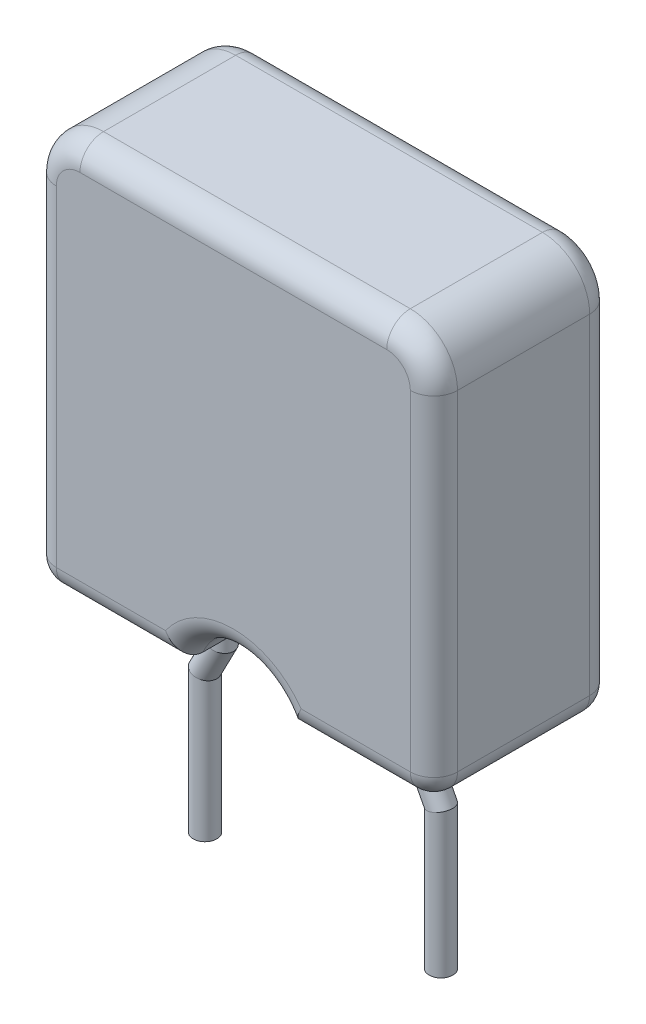
ISO-10303-21;
HEADER;
FILE_DESCRIPTION(('STEP AP214'),'2;1');
FILE_NAME('part.step','',(''),(''),'','','');
FILE_SCHEMA(('AUTOMOTIVE_DESIGN { 1 0 10303 214 1 1 1 1 }'));
ENDSEC;
DATA;
#1=APPLICATION_CONTEXT('core data for automotive mechanical design processes');
#2=APPLICATION_PROTOCOL_DEFINITION('international standard','automotive_design',2000,#1);
#3=PRODUCT_CONTEXT('',#1,'mechanical');
#4=PRODUCT('Part','Part','',(#3));
#5=PRODUCT_RELATED_PRODUCT_CATEGORY('part','',(#4));
#6=PRODUCT_DEFINITION_FORMATION('','',#4);
#7=PRODUCT_DEFINITION_CONTEXT('part definition',#1,'design');
#8=PRODUCT_DEFINITION('design','',#6,#7);
#9=PRODUCT_DEFINITION_SHAPE('','',#8);
#10=(LENGTH_UNIT() NAMED_UNIT(*) SI_UNIT(.MILLI.,.METRE.));
#11=(NAMED_UNIT(*) PLANE_ANGLE_UNIT() SI_UNIT($,.RADIAN.));
#12=(NAMED_UNIT(*) SI_UNIT($,.STERADIAN.) SOLID_ANGLE_UNIT());
#13=UNCERTAINTY_MEASURE_WITH_UNIT(LENGTH_MEASURE(1.E-05),#10,'distance_accuracy_value','');
#14=(GEOMETRIC_REPRESENTATION_CONTEXT(3) GLOBAL_UNCERTAINTY_ASSIGNED_CONTEXT((#13)) GLOBAL_UNIT_ASSIGNED_CONTEXT((#10,
#11,#12)) REPRESENTATION_CONTEXT('',''));
#15=CARTESIAN_POINT('',(0.,0.,0.));
#16=DIRECTION('',(0.,0.,1.));
#17=DIRECTION('',(1.,0.,0.));
#18=AXIS2_PLACEMENT_3D('',#15,#16,#17);
#19=CARTESIAN_POINT('',(-4.25,-4.25,3.8));
#20=DIRECTION('',(0.,1.,0.));
#21=DIRECTION('',(0.,0.,1.));
#22=AXIS2_PLACEMENT_3D('',#19,#20,#21);
#23=PLANE('',#22);
#24=CARTESIAN_POINT('',(-2.14564392373896,-4.25,1.9));
#25=DIRECTION('',(0.,1.,0.));
#26=DIRECTION('',(0.,0.,1.));
#27=AXIS2_PLACEMENT_3D('',#24,#25,#26);
#28=CIRCLE('',#27,0.25);
#29=CARTESIAN_POINT('',(-2.14564392373896,-4.25,2.15));
#30=VERTEX_POINT('',#29);
#31=EDGE_CURVE('E76',#30,#30,#28,.F.);
#32=ORIENTED_EDGE('',*,*,#31,.F.);
#33=EDGE_LOOP('',(#32));
#34=FACE_BOUND('',#33,.T.);
#35=DIRECTION('',(0.,0.,-1.));
#36=VECTOR('',#35,1.);
#37=CARTESIAN_POINT('',(-3.75,-4.25,3.8));
#38=LINE('',#37,#36);
#39=CARTESIAN_POINT('',(-3.75,-4.25,3.3));
#40=VERTEX_POINT('',#39);
#41=CARTESIAN_POINT('',(-3.75,-4.25,0.5));
#42=VERTEX_POINT('',#41);
#43=EDGE_CURVE('E491',#40,#42,#38,.T.);
#44=ORIENTED_EDGE('',*,*,#43,.T.);
#45=DIRECTION('',(1.,0.,0.));
#46=VECTOR('',#45,1.);
#47=CARTESIAN_POINT('',(-1.14564392373896,-4.25,0.5));
#48=LINE('',#47,#46);
#49=CARTESIAN_POINT('',(-1.14564392373896,-4.25,0.5));
#50=VERTEX_POINT('',#49);
#51=EDGE_CURVE('E262',#42,#50,#48,.T.);
#52=ORIENTED_EDGE('',*,*,#51,.T.);
#53=DIRECTION('',(0.,0.,1.));
#54=VECTOR('',#53,1.);
#55=CARTESIAN_POINT('',(-1.14564392373896,-4.25,0.));
#56=LINE('',#55,#54);
#57=CARTESIAN_POINT('',(-1.14564392373896,-4.25,3.3));
#58=VERTEX_POINT('',#57);
#59=EDGE_CURVE('E466',#50,#58,#56,.T.);
#60=ORIENTED_EDGE('',*,*,#59,.T.);
#61=DIRECTION('',(1.,0.,0.));
#62=VECTOR('',#61,1.);
#63=CARTESIAN_POINT('',(-4.25,-4.25,3.3));
#64=LINE('',#63,#62);
#65=EDGE_CURVE('E259',#58,#40,#64,.F.);
#66=ORIENTED_EDGE('',*,*,#65,.T.);
#67=EDGE_LOOP('',(#44,#52,#60,#66));
#68=FACE_BOUND('',#67,.T.);
#69=ADVANCED_FACE('F67',(#34,#68),#23,.F.);
#70=CARTESIAN_POINT('',(4.25,-4.25,3.8));
#71=DIRECTION('',(-1.,0.,0.));
#72=DIRECTION('',(0.,0.,1.));
#73=AXIS2_PLACEMENT_3D('',#70,#71,#72);
#74=PLANE('',#73);
#75=DIRECTION('',(0.,0.,-1.));
#76=VECTOR('',#75,1.);
#77=CARTESIAN_POINT('',(4.25,-3.75,3.8));
#78=LINE('',#77,#76);
#79=CARTESIAN_POINT('',(4.25,-3.75,3.3));
#80=VERTEX_POINT('',#79);
#81=CARTESIAN_POINT('',(4.25,-3.75,0.5));
#82=VERTEX_POINT('',#81);
#83=EDGE_CURVE('E480',#80,#82,#78,.T.);
#84=ORIENTED_EDGE('',*,*,#83,.T.);
#85=DIRECTION('',(0.,1.,0.));
#86=VECTOR('',#85,1.);
#87=CARTESIAN_POINT('',(4.25,3.25,0.5));
#88=LINE('',#87,#86);
#89=CARTESIAN_POINT('',(4.25,3.25,0.5));
#90=VERTEX_POINT('',#89);
#91=EDGE_CURVE('E287',#82,#90,#88,.T.);
#92=ORIENTED_EDGE('',*,*,#91,.T.);
#93=DIRECTION('',(0.,0.,-1.));
#94=VECTOR('',#93,1.);
#95=CARTESIAN_POINT('',(4.25,3.25,3.8));
#96=LINE('',#95,#94);
#97=CARTESIAN_POINT('',(4.25,3.25,3.3));
#98=VERTEX_POINT('',#97);
#99=EDGE_CURVE('E495',#90,#98,#96,.F.);
#100=ORIENTED_EDGE('',*,*,#99,.T.);
#101=DIRECTION('',(0.,1.,0.));
#102=VECTOR('',#101,1.);
#103=CARTESIAN_POINT('',(4.25,-4.25,3.3));
#104=LINE('',#103,#102);
#105=EDGE_CURVE('E284',#98,#80,#104,.F.);
#106=ORIENTED_EDGE('',*,*,#105,.T.);
#107=EDGE_LOOP('',(#84,#92,#100,#106));
#108=FACE_BOUND('',#107,.T.);
#109=ADVANCED_FACE('F429',(#108),#74,.F.);
#110=CARTESIAN_POINT('',(-4.25,4.25,3.8));
#111=DIRECTION('',(0.,-1.,0.));
#112=DIRECTION('',(0.,0.,-1.));
#113=AXIS2_PLACEMENT_3D('',#110,#111,#112);
#114=PLANE('',#113);
#115=DIRECTION('',(0.,0.,-1.));
#116=VECTOR('',#115,1.);
#117=CARTESIAN_POINT('',(3.25,4.25,3.8));
#118=LINE('',#117,#116);
#119=CARTESIAN_POINT('',(3.25,4.25,3.3));
#120=VERTEX_POINT('',#119);
#121=CARTESIAN_POINT('',(3.25,4.25,0.5));
#122=VERTEX_POINT('',#121);
#123=EDGE_CURVE('E532',#120,#122,#118,.T.);
#124=ORIENTED_EDGE('',*,*,#123,.T.);
#125=DIRECTION('',(-1.,0.,0.));
#126=VECTOR('',#125,1.);
#127=CARTESIAN_POINT('',(-3.25,4.25,0.5));
#128=LINE('',#127,#126);
#129=CARTESIAN_POINT('',(-3.25,4.25,0.5));
#130=VERTEX_POINT('',#129);
#131=EDGE_CURVE('E239',#122,#130,#128,.T.);
#132=ORIENTED_EDGE('',*,*,#131,.T.);
#133=DIRECTION('',(0.,0.,-1.));
#134=VECTOR('',#133,1.);
#135=CARTESIAN_POINT('',(-3.25,4.25,3.8));
#136=LINE('',#135,#134);
#137=CARTESIAN_POINT('',(-3.25,4.25,3.3));
#138=VERTEX_POINT('',#137);
#139=EDGE_CURVE('E536',#130,#138,#136,.F.);
#140=ORIENTED_EDGE('',*,*,#139,.T.);
#141=DIRECTION('',(-1.,0.,0.));
#142=VECTOR('',#141,1.);
#143=CARTESIAN_POINT('',(-4.25,4.25,3.3));
#144=LINE('',#143,#142);
#145=EDGE_CURVE('E236',#138,#120,#144,.F.);
#146=ORIENTED_EDGE('',*,*,#145,.T.);
#147=EDGE_LOOP('',(#124,#132,#140,#146));
#148=FACE_BOUND('',#147,.T.);
#149=ADVANCED_FACE('F436',(#148),#114,.F.);
#150=CARTESIAN_POINT('',(-4.25,-4.25,3.8));
#151=DIRECTION('',(1.,0.,0.));
#152=DIRECTION('',(0.,0.,-1.));
#153=AXIS2_PLACEMENT_3D('',#150,#151,#152);
#154=PLANE('',#153);
#155=DIRECTION('',(0.,0.,-1.));
#156=VECTOR('',#155,1.);
#157=CARTESIAN_POINT('',(-4.25,3.25,3.8));
#158=LINE('',#157,#156);
#159=CARTESIAN_POINT('',(-4.25,3.25,3.3));
#160=VERTEX_POINT('',#159);
#161=CARTESIAN_POINT('',(-4.25,3.25,0.5));
#162=VERTEX_POINT('',#161);
#163=EDGE_CURVE('E487',#160,#162,#158,.T.);
#164=ORIENTED_EDGE('',*,*,#163,.T.);
#165=DIRECTION('',(0.,-1.,0.));
#166=VECTOR('',#165,1.);
#167=CARTESIAN_POINT('',(-4.25,-3.75,0.5));
#168=LINE('',#167,#166);
#169=CARTESIAN_POINT('',(-4.25,-3.75,0.5));
#170=VERTEX_POINT('',#169);
#171=EDGE_CURVE('E250',#162,#170,#168,.T.);
#172=ORIENTED_EDGE('',*,*,#171,.T.);
#173=DIRECTION('',(0.,0.,-1.));
#174=VECTOR('',#173,1.);
#175=CARTESIAN_POINT('',(-4.25,-3.75,3.8));
#176=LINE('',#175,#174);
#177=CARTESIAN_POINT('',(-4.25,-3.75,3.3));
#178=VERTEX_POINT('',#177);
#179=EDGE_CURVE('E216',#170,#178,#176,.F.);
#180=ORIENTED_EDGE('',*,*,#179,.T.);
#181=DIRECTION('',(0.,-1.,0.));
#182=VECTOR('',#181,1.);
#183=CARTESIAN_POINT('',(-4.25,-4.25,3.3));
#184=LINE('',#183,#182);
#185=EDGE_CURVE('E247',#178,#160,#184,.F.);
#186=ORIENTED_EDGE('',*,*,#185,.T.);
#187=EDGE_LOOP('',(#164,#172,#180,#186));
#188=FACE_BOUND('',#187,.T.);
#189=ADVANCED_FACE('F445',(#188),#154,.F.);
#190=CARTESIAN_POINT('',(2.14564392373896,-4.25,1.9));
#191=DIRECTION('',(0.,1.,0.));
#192=DIRECTION('',(0.,0.,1.));
#193=AXIS2_PLACEMENT_3D('',#190,#191,#192);
#194=CIRCLE('',#193,0.25);
#195=CARTESIAN_POINT('',(2.14564392373896,-4.25,2.15));
#196=VERTEX_POINT('',#195);
#197=EDGE_CURVE('E12',#196,#196,#194,.F.);
#198=ORIENTED_EDGE('',*,*,#197,.F.);
#199=EDGE_LOOP('',(#198));
#200=FACE_BOUND('',#199,.T.);
#201=DIRECTION('',(0.,0.,1.));
#202=VECTOR('',#201,1.);
#203=CARTESIAN_POINT('',(1.14564392373896,-4.25,0.));
#204=LINE('',#203,#202);
#205=CARTESIAN_POINT('',(1.14564392373896,-4.25,3.3));
#206=VERTEX_POINT('',#205);
#207=CARTESIAN_POINT('',(1.14564392373896,-4.25,0.5));
#208=VERTEX_POINT('',#207);
#209=EDGE_CURVE('E457',#206,#208,#204,.F.);
#210=ORIENTED_EDGE('',*,*,#209,.T.);
#211=DIRECTION('',(1.,0.,0.));
#212=VECTOR('',#211,1.);
#213=CARTESIAN_POINT('',(3.75,-4.25,0.5));
#214=LINE('',#213,#212);
#215=CARTESIAN_POINT('',(3.75,-4.25,0.5));
#216=VERTEX_POINT('',#215);
#217=EDGE_CURVE('E275',#208,#216,#214,.T.);
#218=ORIENTED_EDGE('',*,*,#217,.T.);
#219=DIRECTION('',(0.,0.,-1.));
#220=VECTOR('',#219,1.);
#221=CARTESIAN_POINT('',(3.75,-4.25,3.8));
#222=LINE('',#221,#220);
#223=CARTESIAN_POINT('',(3.75,-4.25,3.3));
#224=VERTEX_POINT('',#223);
#225=EDGE_CURVE('E482',#216,#224,#222,.F.);
#226=ORIENTED_EDGE('',*,*,#225,.T.);
#227=DIRECTION('',(1.,0.,0.));
#228=VECTOR('',#227,1.);
#229=CARTESIAN_POINT('',(-4.25,-4.25,3.3));
#230=LINE('',#229,#228);
#231=EDGE_CURVE('E272',#224,#206,#230,.F.);
#232=ORIENTED_EDGE('',*,*,#231,.T.);
#233=EDGE_LOOP('',(#210,#218,#226,#232));
#234=FACE_BOUND('',#233,.T.);
#235=ADVANCED_FACE('F432',(#200,#234),#23,.F.);
#236=CARTESIAN_POINT('',(0.,0.,3.8));
#237=DIRECTION('',(0.,0.,-1.));
#238=DIRECTION('',(-1.,0.,0.));
#239=AXIS2_PLACEMENT_3D('',#236,#237,#238);
#240=PLANE('',#239);
#241=DIRECTION('',(1.,0.,0.));
#242=VECTOR('',#241,1.);
#243=CARTESIAN_POINT('',(0.,-3.75,3.8));
#244=LINE('',#243,#242);
#245=CARTESIAN_POINT('',(-3.75,-3.75,3.8));
#246=VERTEX_POINT('',#245);
#247=CARTESIAN_POINT('',(-1.43614066163451,-3.75,3.8));
#248=VERTEX_POINT('',#247);
#249=EDGE_CURVE('E83',#246,#248,#244,.T.);
#250=ORIENTED_EDGE('',*,*,#249,.T.);
#251=CARTESIAN_POINT('',(0.,-4.75,3.8));
#252=DIRECTION('',(0.,0.,-1.));
#253=DIRECTION('',(-1.,0.,0.));
#254=AXIS2_PLACEMENT_3D('',#251,#252,#253);
#255=CIRCLE('',#254,1.75);
#256=CARTESIAN_POINT('',(1.43614066163451,-3.75,3.8));
#257=VERTEX_POINT('',#256);
#258=EDGE_CURVE('E308',#248,#257,#255,.T.);
#259=ORIENTED_EDGE('',*,*,#258,.T.);
#260=DIRECTION('',(1.,0.,0.));
#261=VECTOR('',#260,1.);
#262=CARTESIAN_POINT('',(0.,-3.75,3.8));
#263=LINE('',#262,#261);
#264=CARTESIAN_POINT('',(3.75,-3.75,3.8));
#265=VERTEX_POINT('',#264);
#266=EDGE_CURVE('E290',#257,#265,#263,.T.);
#267=ORIENTED_EDGE('',*,*,#266,.T.);
#268=DIRECTION('',(0.,1.,0.));
#269=VECTOR('',#268,1.);
#270=CARTESIAN_POINT('',(3.75,0.,3.8));
#271=LINE('',#270,#269);
#272=CARTESIAN_POINT('',(3.75,3.25,3.8));
#273=VERTEX_POINT('',#272);
#274=EDGE_CURVE('E293',#265,#273,#271,.T.);
#275=ORIENTED_EDGE('',*,*,#274,.T.);
#276=CARTESIAN_POINT('',(3.25,3.25,3.8));
#277=DIRECTION('',(0.,0.,-1.));
#278=DIRECTION('',(-1.,0.,0.));
#279=AXIS2_PLACEMENT_3D('',#276,#277,#278);
#280=CIRCLE('',#279,0.5);
#281=CARTESIAN_POINT('',(3.25,3.75,3.8));
#282=VERTEX_POINT('',#281);
#283=EDGE_CURVE('E296',#273,#282,#280,.F.);
#284=ORIENTED_EDGE('',*,*,#283,.T.);
#285=DIRECTION('',(-1.,0.,0.));
#286=VECTOR('',#285,1.);
#287=CARTESIAN_POINT('',(0.,3.75,3.8));
#288=LINE('',#287,#286);
#289=CARTESIAN_POINT('',(-3.25,3.75,3.8));
#290=VERTEX_POINT('',#289);
#291=EDGE_CURVE('E299',#282,#290,#288,.T.);
#292=ORIENTED_EDGE('',*,*,#291,.T.);
#293=CARTESIAN_POINT('',(-3.25,3.25,3.8));
#294=DIRECTION('',(0.,0.,-1.));
#295=DIRECTION('',(-1.,0.,0.));
#296=AXIS2_PLACEMENT_3D('',#293,#294,#295);
#297=CIRCLE('',#296,0.5);
#298=CARTESIAN_POINT('',(-3.75,3.25,3.8));
#299=VERTEX_POINT('',#298);
#300=EDGE_CURVE('E302',#290,#299,#297,.F.);
#301=ORIENTED_EDGE('',*,*,#300,.T.);
#302=DIRECTION('',(0.,-1.,0.));
#303=VECTOR('',#302,1.);
#304=CARTESIAN_POINT('',(-3.75,0.,3.8));
#305=LINE('',#304,#303);
#306=EDGE_CURVE('E88',#299,#246,#305,.T.);
#307=ORIENTED_EDGE('',*,*,#306,.T.);
#308=EDGE_LOOP('',(#250,#259,#267,#275,#284,#292,#301,#307));
#309=FACE_BOUND('',#308,.T.);
#310=ADVANCED_FACE('F444',(#309),#240,.F.);
#311=CARTESIAN_POINT('',(0.,0.,0.));
#312=DIRECTION('',(0.,0.,-1.));
#313=DIRECTION('',(-1.,0.,0.));
#314=AXIS2_PLACEMENT_3D('',#311,#312,#313);
#315=PLANE('',#314);
#316=DIRECTION('',(-1.,0.,0.));
#317=VECTOR('',#316,1.);
#318=CARTESIAN_POINT('',(3.25,3.75,0.));
#319=LINE('',#318,#317);
#320=CARTESIAN_POINT('',(-3.25,3.75,0.));
#321=VERTEX_POINT('',#320);
#322=CARTESIAN_POINT('',(3.25,3.75,0.));
#323=VERTEX_POINT('',#322);
#324=EDGE_CURVE('E220',#321,#323,#319,.F.);
#325=ORIENTED_EDGE('',*,*,#324,.T.);
#326=CARTESIAN_POINT('',(3.25,3.25,0.));
#327=DIRECTION('',(0.,0.,-1.));
#328=DIRECTION('',(-1.,0.,0.));
#329=AXIS2_PLACEMENT_3D('',#326,#327,#328);
#330=CIRCLE('',#329,0.5);
#331=CARTESIAN_POINT('',(3.75,3.25,0.));
#332=VERTEX_POINT('',#331);
#333=EDGE_CURVE('E198',#323,#332,#330,.T.);
#334=ORIENTED_EDGE('',*,*,#333,.T.);
#335=DIRECTION('',(0.,1.,0.));
#336=VECTOR('',#335,1.);
#337=CARTESIAN_POINT('',(3.75,-3.75,0.));
#338=LINE('',#337,#336);
#339=CARTESIAN_POINT('',(3.75,-3.75,0.));
#340=VERTEX_POINT('',#339);
#341=EDGE_CURVE('E208',#332,#340,#338,.F.);
#342=ORIENTED_EDGE('',*,*,#341,.T.);
#343=DIRECTION('',(1.,0.,0.));
#344=VECTOR('',#343,1.);
#345=CARTESIAN_POINT('',(1.14564392373896,-3.75,0.));
#346=LINE('',#345,#344);
#347=CARTESIAN_POINT('',(1.43614066163451,-3.75,0.));
#348=VERTEX_POINT('',#347);
#349=EDGE_CURVE('E215',#340,#348,#346,.F.);
#350=ORIENTED_EDGE('',*,*,#349,.T.);
#351=CARTESIAN_POINT('',(0.,-4.75,0.));
#352=DIRECTION('',(0.,0.,-1.));
#353=DIRECTION('',(-1.,0.,0.));
#354=AXIS2_PLACEMENT_3D('',#351,#352,#353);
#355=CIRCLE('',#354,1.75);
#356=CARTESIAN_POINT('',(-1.43614066163451,-3.75,0.));
#357=VERTEX_POINT('',#356);
#358=EDGE_CURVE('E470',#348,#357,#355,.F.);
#359=ORIENTED_EDGE('',*,*,#358,.T.);
#360=DIRECTION('',(1.,0.,0.));
#361=VECTOR('',#360,1.);
#362=CARTESIAN_POINT('',(-3.75,-3.75,0.));
#363=LINE('',#362,#361);
#364=CARTESIAN_POINT('',(-3.75,-3.75,0.));
#365=VERTEX_POINT('',#364);
#366=EDGE_CURVE('E509',#357,#365,#363,.F.);
#367=ORIENTED_EDGE('',*,*,#366,.T.);
#368=DIRECTION('',(0.,-1.,0.));
#369=VECTOR('',#368,1.);
#370=CARTESIAN_POINT('',(-3.75,3.25,0.));
#371=LINE('',#370,#369);
#372=CARTESIAN_POINT('',(-3.75,3.25,0.));
#373=VERTEX_POINT('',#372);
#374=EDGE_CURVE('E512',#365,#373,#371,.F.);
#375=ORIENTED_EDGE('',*,*,#374,.T.);
#376=CARTESIAN_POINT('',(-3.25,3.25,0.));
#377=DIRECTION('',(0.,0.,-1.));
#378=DIRECTION('',(-1.,0.,0.));
#379=AXIS2_PLACEMENT_3D('',#376,#377,#378);
#380=CIRCLE('',#379,0.5);
#381=EDGE_CURVE('E230',#373,#321,#380,.T.);
#382=ORIENTED_EDGE('',*,*,#381,.T.);
#383=EDGE_LOOP('',(#325,#334,#342,#350,#359,#367,#375,#382));
#384=FACE_BOUND('',#383,.T.);
#385=ADVANCED_FACE('F218',(#384),#315,.T.);
#386=CARTESIAN_POINT('',(0.,-4.75,0.));
#387=DIRECTION('',(0.,0.,1.));
#388=DIRECTION('',(1.,0.,0.));
#389=AXIS2_PLACEMENT_3D('',#386,#387,#388);
#390=CYLINDRICAL_SURFACE('',#389,1.25);
#391=ORIENTED_EDGE('',*,*,#59,.F.);
#392=CARTESIAN_POINT('',(0.,-4.75,0.5));
#393=DIRECTION('',(0.,0.,-1.));
#394=DIRECTION('',(-1.,0.,0.));
#395=AXIS2_PLACEMENT_3D('',#392,#393,#394);
#396=CIRCLE('',#395,1.25);
#397=EDGE_CURVE('E269',#50,#208,#396,.T.);
#398=ORIENTED_EDGE('',*,*,#397,.T.);
#399=ORIENTED_EDGE('',*,*,#209,.F.);
#400=CARTESIAN_POINT('',(0.,-4.75,3.3));
#401=DIRECTION('',(0.,0.,-1.));
#402=DIRECTION('',(-1.,0.,0.));
#403=AXIS2_PLACEMENT_3D('',#400,#401,#402);
#404=CIRCLE('',#403,1.25);
#405=EDGE_CURVE('E265',#206,#58,#404,.F.);
#406=ORIENTED_EDGE('',*,*,#405,.T.);
#407=EDGE_LOOP('',(#391,#398,#399,#406));
#408=FACE_BOUND('',#407,.T.);
#409=ADVANCED_FACE('F597',(#408),#390,.F.);
#410=CARTESIAN_POINT('',(3.25,3.25,3.8));
#411=DIRECTION('',(0.,0.,-1.));
#412=DIRECTION('',(-1.,0.,0.));
#413=AXIS2_PLACEMENT_3D('',#410,#411,#412);
#414=CYLINDRICAL_SURFACE('',#413,1.);
#415=ORIENTED_EDGE('',*,*,#99,.F.);
#416=CARTESIAN_POINT('',(3.25,3.25,0.5));
#417=DIRECTION('',(0.,0.,-1.));
#418=DIRECTION('',(-1.,0.,0.));
#419=AXIS2_PLACEMENT_3D('',#416,#417,#418);
#420=CIRCLE('',#419,1.);
#421=EDGE_CURVE('E200',#90,#122,#420,.F.);
#422=ORIENTED_EDGE('',*,*,#421,.T.);
#423=ORIENTED_EDGE('',*,*,#123,.F.);
#424=CARTESIAN_POINT('',(3.25,3.25,3.3));
#425=DIRECTION('',(0.,0.,-1.));
#426=DIRECTION('',(-1.,0.,0.));
#427=AXIS2_PLACEMENT_3D('',#424,#425,#426);
#428=CIRCLE('',#427,1.);
#429=EDGE_CURVE('E223',#120,#98,#428,.T.);
#430=ORIENTED_EDGE('',*,*,#429,.T.);
#431=EDGE_LOOP('',(#415,#422,#423,#430));
#432=FACE_BOUND('',#431,.T.);
#433=ADVANCED_FACE('F531',(#432),#414,.T.);
#434=CARTESIAN_POINT('',(-3.25,3.25,3.8));
#435=DIRECTION('',(0.,0.,-1.));
#436=DIRECTION('',(-1.,0.,0.));
#437=AXIS2_PLACEMENT_3D('',#434,#435,#436);
#438=CYLINDRICAL_SURFACE('',#437,1.);
#439=ORIENTED_EDGE('',*,*,#139,.F.);
#440=CARTESIAN_POINT('',(-3.25,3.25,0.5));
#441=DIRECTION('',(0.,0.,-1.));
#442=DIRECTION('',(-1.,0.,0.));
#443=AXIS2_PLACEMENT_3D('',#440,#441,#442);
#444=CIRCLE('',#443,1.);
#445=EDGE_CURVE('E244',#130,#162,#444,.F.);
#446=ORIENTED_EDGE('',*,*,#445,.T.);
#447=ORIENTED_EDGE('',*,*,#163,.F.);
#448=CARTESIAN_POINT('',(-3.25,3.25,3.3));
#449=DIRECTION('',(0.,0.,-1.));
#450=DIRECTION('',(-1.,0.,0.));
#451=AXIS2_PLACEMENT_3D('',#448,#449,#450);
#452=CIRCLE('',#451,1.);
#453=EDGE_CURVE('E242',#160,#138,#452,.T.);
#454=ORIENTED_EDGE('',*,*,#453,.T.);
#455=EDGE_LOOP('',(#439,#446,#447,#454));
#456=FACE_BOUND('',#455,.T.);
#457=ADVANCED_FACE('F612',(#456),#438,.T.);
#458=CARTESIAN_POINT('',(3.75,-3.75,3.8));
#459=DIRECTION('',(0.,0.,-1.));
#460=DIRECTION('',(-1.,0.,0.));
#461=AXIS2_PLACEMENT_3D('',#458,#459,#460);
#462=CYLINDRICAL_SURFACE('',#461,0.5);
#463=ORIENTED_EDGE('',*,*,#225,.F.);
#464=CARTESIAN_POINT('',(3.75,-3.75,0.5));
#465=DIRECTION('',(0.,0.,-1.));
#466=DIRECTION('',(-1.,0.,0.));
#467=AXIS2_PLACEMENT_3D('',#464,#465,#466);
#468=CIRCLE('',#467,0.5);
#469=EDGE_CURVE('E281',#216,#82,#468,.F.);
#470=ORIENTED_EDGE('',*,*,#469,.T.);
#471=ORIENTED_EDGE('',*,*,#83,.F.);
#472=CARTESIAN_POINT('',(3.75,-3.75,3.3));
#473=DIRECTION('',(0.,0.,-1.));
#474=DIRECTION('',(-1.,0.,0.));
#475=AXIS2_PLACEMENT_3D('',#472,#473,#474);
#476=CIRCLE('',#475,0.5);
#477=EDGE_CURVE('E278',#80,#224,#476,.T.);
#478=ORIENTED_EDGE('',*,*,#477,.T.);
#479=EDGE_LOOP('',(#463,#470,#471,#478));
#480=FACE_BOUND('',#479,.T.);
#481=ADVANCED_FACE('F479',(#480),#462,.T.);
#482=CARTESIAN_POINT('',(-3.75,-3.75,3.8));
#483=DIRECTION('',(0.,0.,-1.));
#484=DIRECTION('',(-1.,0.,0.));
#485=AXIS2_PLACEMENT_3D('',#482,#483,#484);
#486=CYLINDRICAL_SURFACE('',#485,0.5);
#487=ORIENTED_EDGE('',*,*,#179,.F.);
#488=CARTESIAN_POINT('',(-3.75,-3.75,0.5));
#489=DIRECTION('',(0.,0.,-1.));
#490=DIRECTION('',(-1.,0.,0.));
#491=AXIS2_PLACEMENT_3D('',#488,#489,#490);
#492=CIRCLE('',#491,0.5);
#493=EDGE_CURVE('E256',#170,#42,#492,.F.);
#494=ORIENTED_EDGE('',*,*,#493,.T.);
#495=ORIENTED_EDGE('',*,*,#43,.F.);
#496=CARTESIAN_POINT('',(-3.75,-3.75,3.3));
#497=DIRECTION('',(0.,0.,-1.));
#498=DIRECTION('',(-1.,0.,0.));
#499=AXIS2_PLACEMENT_3D('',#496,#497,#498);
#500=CIRCLE('',#499,0.5);
#501=EDGE_CURVE('E253',#40,#178,#500,.T.);
#502=ORIENTED_EDGE('',*,*,#501,.T.);
#503=EDGE_LOOP('',(#487,#494,#495,#502));
#504=FACE_BOUND('',#503,.T.);
#505=ADVANCED_FACE('F365',(#504),#486,.T.);
#506=CARTESIAN_POINT('',(-4.25,-3.75,0.5));
#507=DIRECTION('',(-1.,0.,0.));
#508=DIRECTION('',(0.,0.,1.));
#509=AXIS2_PLACEMENT_3D('',#506,#507,#508);
#510=CYLINDRICAL_SURFACE('',#509,0.5);
#511=CARTESIAN_POINT('',(-1.14564392373896,-4.25,0.5));
#512=CARTESIAN_POINT('',(-1.1456146359931,-4.25003415709231,0.474929334473534));
#513=CARTESIAN_POINT('',(-1.14687682330495,-4.24811696321521,0.449898019227566));
#514=CARTESIAN_POINT('',(-1.15174187825817,-4.24066704356725,0.400749004404432));
#515=CARTESIAN_POINT('',(-1.15533182598775,-4.23515427355561,0.376627034973077));
#516=CARTESIAN_POINT('',(-1.16460798670412,-4.22080548310635,0.329875204686569));
#517=CARTESIAN_POINT('',(-1.17029107042402,-4.21197442316128,0.307243175584258));
#518=CARTESIAN_POINT('',(-1.18341039109392,-4.19138872202612,0.263880351840279));
#519=CARTESIAN_POINT('',(-1.19084879186248,-4.17963047143169,0.243151948005364));
#520=CARTESIAN_POINT('',(-1.20768989374385,-4.15270701111219,0.202576417153045));
#521=CARTESIAN_POINT('',(-1.21719340181637,-4.13736139864625,0.182891544315591));
#522=CARTESIAN_POINT('',(-1.23739499880522,-4.10430386268454,0.146338271128829));
#523=CARTESIAN_POINT('',(-1.24809336559409,-4.08659138857006,0.129470528207656));
#524=CARTESIAN_POINT('',(-1.27204457641314,-4.04637778986672,0.0963436722693501));
#525=CARTESIAN_POINT('',(-1.28543789225902,-4.02355856743157,0.0805719352400187));
#526=CARTESIAN_POINT('',(-1.312925504268,-3.97594398607556,0.0531156497158105));
#527=CARTESIAN_POINT('',(-1.32702052709397,-3.95114656189465,0.0414354432290436));
#528=CARTESIAN_POINT('',(-1.35660565503913,-3.89823732239151,0.0215826353260559));
#529=CARTESIAN_POINT('',(-1.37212106432067,-3.87001643725394,0.0137391160013262));
#530=CARTESIAN_POINT('',(-1.40311135663168,-3.81267856655792,0.00309124109019107));
#531=CARTESIAN_POINT('',(-1.41858624759414,-3.78356389301503,0.000274842400073076));
#532=CARTESIAN_POINT('',(-1.43461673913581,-3.75291693979513,6.36804739412453E-06));
#533=CARTESIAN_POINT('',(-1.43537897170078,-3.75145853700219,-1.52183481479329E-08));
#534=CARTESIAN_POINT('',(-1.43614066163451,-3.75,0.));
#535=B_SPLINE_CURVE_WITH_KNOTS('',3,(#511,#512,#513,#514,#515,#516,#517,#518,#519,#520,#521,
#522,#523,#524,#525,#526,#527,#528,#529,#530,#531,#532,#533,#534),.UNSPECIFIED.,.F.,.F.,(4,2,2,
2,2,2,2,2,2,2,2,4),(0.,0.075045049507425,0.149677096622654,0.224198017733066,0.298811286801887,
0.378627647518531,0.458462608875667,0.550503996168851,0.642642765669475,0.741697382406836,
0.840514381161582,0.845451104859349),.UNSPECIFIED.);
#536=EDGE_CURVE('E351',#50,#357,#535,.T.);
#537=ORIENTED_EDGE('',*,*,#536,.F.);
#538=ORIENTED_EDGE('',*,*,#51,.F.);
#539=CARTESIAN_POINT('',(-3.75,-3.75,0.5));
#540=DIRECTION('',(-1.,0.,0.));
#541=DIRECTION('',(0.,0.,1.));
#542=AXIS2_PLACEMENT_3D('',#539,#540,#541);
#543=CIRCLE('',#542,0.5);
#544=EDGE_CURVE('E359',#365,#42,#543,.T.);
#545=ORIENTED_EDGE('',*,*,#544,.F.);
#546=ORIENTED_EDGE('',*,*,#366,.F.);
#547=EDGE_LOOP('',(#537,#538,#545,#546));
#548=FACE_BOUND('',#547,.T.);
#549=ADVANCED_FACE('F361',(#548),#510,.T.);
#550=CARTESIAN_POINT('',(-3.75,-3.75,0.5));
#551=DIRECTION('',(0.,0.,-1.));
#552=DIRECTION('',(-1.,0.,0.));
#553=AXIS2_PLACEMENT_3D('',#550,#551,#552);
#554=SPHERICAL_SURFACE('',#553,0.5);
#555=ORIENTED_EDGE('',*,*,#544,.T.);
#556=ORIENTED_EDGE('',*,*,#493,.F.);
#557=CARTESIAN_POINT('',(-3.75,-3.75,0.5));
#558=DIRECTION('',(0.,1.,0.));
#559=DIRECTION('',(0.,0.,1.));
#560=AXIS2_PLACEMENT_3D('',#557,#558,#559);
#561=CIRCLE('',#560,0.5);
#562=EDGE_CURVE('E337',#365,#170,#561,.T.);
#563=ORIENTED_EDGE('',*,*,#562,.F.);
#564=EDGE_LOOP('',(#555,#556,#563));
#565=FACE_BOUND('',#564,.T.);
#566=ADVANCED_FACE('F347',(#565),#554,.T.);
#567=CARTESIAN_POINT('',(0.,-4.75,0.5));
#568=DIRECTION('',(0.,0.,-1.));
#569=DIRECTION('',(-1.,0.,0.));
#570=AXIS2_PLACEMENT_3D('',#567,#568,#569);
#571=TOROIDAL_SURFACE('',#570,1.75,0.5);
#572=ORIENTED_EDGE('',*,*,#536,.T.);
#573=ORIENTED_EDGE('',*,*,#358,.F.);
#574=CARTESIAN_POINT('',(1.14564392373896,-4.25,0.5));
#575=CARTESIAN_POINT('',(1.1456146359931,-4.25003415709231,0.474929334473534));
#576=CARTESIAN_POINT('',(1.14687682330495,-4.24811696321521,0.449898019227566));
#577=CARTESIAN_POINT('',(1.15174187825817,-4.24066704356725,0.400749004404432));
#578=CARTESIAN_POINT('',(1.15533182598775,-4.23515427355561,0.376627034973077));
#579=CARTESIAN_POINT('',(1.16460798670412,-4.22080548310635,0.329875204686569));
#580=CARTESIAN_POINT('',(1.17029107042402,-4.21197442316128,0.307243175584258));
#581=CARTESIAN_POINT('',(1.18341039109392,-4.19138872202612,0.263880351840279));
#582=CARTESIAN_POINT('',(1.19084879186248,-4.17963047143169,0.243151948005364));
#583=CARTESIAN_POINT('',(1.20768989374385,-4.15270701111219,0.202576417153045));
#584=CARTESIAN_POINT('',(1.21719340181637,-4.13736139864625,0.182891544315591));
#585=CARTESIAN_POINT('',(1.23739499880522,-4.10430386268454,0.146338271128829));
#586=CARTESIAN_POINT('',(1.24809336559409,-4.08659138857006,0.129470528207656));
#587=CARTESIAN_POINT('',(1.27204457641314,-4.04637778986672,0.0963436722693501));
#588=CARTESIAN_POINT('',(1.28543789225902,-4.02355856743157,0.0805719352400187));
#589=CARTESIAN_POINT('',(1.312925504268,-3.97594398607556,0.0531156497158105));
#590=CARTESIAN_POINT('',(1.32702052709397,-3.95114656189465,0.0414354432290436));
#591=CARTESIAN_POINT('',(1.35660565503913,-3.89823732239151,0.0215826353260559));
#592=CARTESIAN_POINT('',(1.37212106432067,-3.87001643725394,0.0137391160013262));
#593=CARTESIAN_POINT('',(1.40311135663168,-3.81267856655792,0.00309124109019107));
#594=CARTESIAN_POINT('',(1.41858624759414,-3.78356389301503,0.000274842400073076));
#595=CARTESIAN_POINT('',(1.43461673913581,-3.75291693979513,6.36804739412453E-06));
#596=CARTESIAN_POINT('',(1.43537897170078,-3.75145853700219,-1.52183481479329E-08));
#597=CARTESIAN_POINT('',(1.43614066163451,-3.75,0.));
#598=B_SPLINE_CURVE_WITH_KNOTS('',3,(#574,#575,#576,#577,#578,#579,#580,#581,#582,#583,#584,
#585,#586,#587,#588,#589,#590,#591,#592,#593,#594,#595,#596,#597),.UNSPECIFIED.,.F.,.F.,(4,2,2,
2,2,2,2,2,2,2,2,4),(0.,0.075045049507425,0.149677096622654,0.224198017733066,0.298811286801887,
0.378627647518531,0.458462608875667,0.550503996168851,0.642642765669475,0.741697382406836,
0.840514381161582,0.845451104859349),.UNSPECIFIED.);
#599=EDGE_CURVE('E327',#208,#348,#598,.T.);
#600=ORIENTED_EDGE('',*,*,#599,.F.);
#601=ORIENTED_EDGE('',*,*,#397,.F.);
#602=EDGE_LOOP('',(#572,#573,#600,#601));
#603=FACE_BOUND('',#602,.T.);
#604=ADVANCED_FACE('F342',(#603),#571,.T.);
#605=CARTESIAN_POINT('',(-3.75,-4.25,0.5));
#606=DIRECTION('',(0.,1.,0.));
#607=DIRECTION('',(0.,0.,1.));
#608=AXIS2_PLACEMENT_3D('',#605,#606,#607);
#609=CYLINDRICAL_SURFACE('',#608,0.5);
#610=ORIENTED_EDGE('',*,*,#562,.T.);
#611=ORIENTED_EDGE('',*,*,#171,.F.);
#612=CARTESIAN_POINT('',(-3.75,3.25,0.5));
#613=DIRECTION('',(0.,1.,0.));
#614=DIRECTION('',(0.,0.,1.));
#615=AXIS2_PLACEMENT_3D('',#612,#613,#614);
#616=CIRCLE('',#615,0.5);
#617=EDGE_CURVE('E323',#373,#162,#616,.T.);
#618=ORIENTED_EDGE('',*,*,#617,.F.);
#619=ORIENTED_EDGE('',*,*,#374,.F.);
#620=EDGE_LOOP('',(#610,#611,#618,#619));
#621=FACE_BOUND('',#620,.T.);
#622=ADVANCED_FACE('F346',(#621),#609,.T.);
#623=CARTESIAN_POINT('',(-4.25,-3.75,0.5));
#624=DIRECTION('',(-1.,0.,0.));
#625=DIRECTION('',(0.,0.,1.));
#626=AXIS2_PLACEMENT_3D('',#623,#624,#625);
#627=CYLINDRICAL_SURFACE('',#626,0.5);
#628=ORIENTED_EDGE('',*,*,#599,.T.);
#629=ORIENTED_EDGE('',*,*,#349,.F.);
#630=CARTESIAN_POINT('',(3.75,-3.75,0.5));
#631=DIRECTION('',(1.,0.,0.));
#632=DIRECTION('',(0.,0.,-1.));
#633=AXIS2_PLACEMENT_3D('',#630,#631,#632);
#634=CIRCLE('',#633,0.5);
#635=EDGE_CURVE('E319',#216,#340,#634,.T.);
#636=ORIENTED_EDGE('',*,*,#635,.F.);
#637=ORIENTED_EDGE('',*,*,#217,.F.);
#638=EDGE_LOOP('',(#628,#629,#636,#637));
#639=FACE_BOUND('',#638,.T.);
#640=ADVANCED_FACE('F339',(#639),#627,.T.);
#641=CARTESIAN_POINT('',(-3.25,3.25,0.5));
#642=DIRECTION('',(0.,0.,-1.));
#643=DIRECTION('',(-1.,0.,0.));
#644=AXIS2_PLACEMENT_3D('',#641,#642,#643);
#645=DEGENERATE_TOROIDAL_SURFACE('',#644,0.5,0.5,.T.);
#646=ORIENTED_EDGE('',*,*,#617,.T.);
#647=ORIENTED_EDGE('',*,*,#445,.F.);
#648=CARTESIAN_POINT('',(-3.25,3.75,0.5));
#649=DIRECTION('',(1.,0.,0.));
#650=DIRECTION('',(0.,0.,-1.));
#651=AXIS2_PLACEMENT_3D('',#648,#649,#650);
#652=CIRCLE('',#651,0.5);
#653=EDGE_CURVE('E315',#321,#130,#652,.T.);
#654=ORIENTED_EDGE('',*,*,#653,.F.);
#655=ORIENTED_EDGE('',*,*,#381,.F.);
#656=EDGE_LOOP('',(#646,#647,#654,#655));
#657=FACE_BOUND('',#656,.T.);
#658=ADVANCED_FACE('F521',(#657),#645,.T.);
#659=CARTESIAN_POINT('',(3.75,-3.75,0.5));
#660=DIRECTION('',(0.,0.,-1.));
#661=DIRECTION('',(-1.,0.,0.));
#662=AXIS2_PLACEMENT_3D('',#659,#660,#661);
#663=SPHERICAL_SURFACE('',#662,0.5);
#664=ORIENTED_EDGE('',*,*,#469,.F.);
#665=ORIENTED_EDGE('',*,*,#635,.T.);
#666=CARTESIAN_POINT('',(3.75,-3.75,0.5));
#667=DIRECTION('',(0.,1.,0.));
#668=DIRECTION('',(0.,0.,1.));
#669=AXIS2_PLACEMENT_3D('',#666,#667,#668);
#670=CIRCLE('',#669,0.5);
#671=EDGE_CURVE('E211',#82,#340,#670,.T.);
#672=ORIENTED_EDGE('',*,*,#671,.F.);
#673=EDGE_LOOP('',(#664,#665,#672));
#674=FACE_BOUND('',#673,.T.);
#675=ADVANCED_FACE('F475',(#674),#663,.T.);
#676=CARTESIAN_POINT('',(-4.25,3.75,0.5));
#677=DIRECTION('',(1.,0.,0.));
#678=DIRECTION('',(0.,0.,-1.));
#679=AXIS2_PLACEMENT_3D('',#676,#677,#678);
#680=CYLINDRICAL_SURFACE('',#679,0.5);
#681=ORIENTED_EDGE('',*,*,#653,.T.);
#682=ORIENTED_EDGE('',*,*,#131,.F.);
#683=CARTESIAN_POINT('',(3.25,3.75,0.5));
#684=DIRECTION('',(1.,0.,0.));
#685=DIRECTION('',(0.,0.,-1.));
#686=AXIS2_PLACEMENT_3D('',#683,#684,#685);
#687=CIRCLE('',#686,0.5);
#688=EDGE_CURVE('E204',#323,#122,#687,.T.);
#689=ORIENTED_EDGE('',*,*,#688,.F.);
#690=ORIENTED_EDGE('',*,*,#324,.F.);
#691=EDGE_LOOP('',(#681,#682,#689,#690));
#692=FACE_BOUND('',#691,.T.);
#693=ADVANCED_FACE('F524',(#692),#680,.T.);
#694=CARTESIAN_POINT('',(3.75,-4.25,0.5));
#695=DIRECTION('',(0.,-1.,0.));
#696=DIRECTION('',(0.,0.,-1.));
#697=AXIS2_PLACEMENT_3D('',#694,#695,#696);
#698=CYLINDRICAL_SURFACE('',#697,0.5);
#699=ORIENTED_EDGE('',*,*,#671,.T.);
#700=ORIENTED_EDGE('',*,*,#341,.F.);
#701=CARTESIAN_POINT('',(3.75,3.25,0.5));
#702=DIRECTION('',(0.,1.,0.));
#703=DIRECTION('',(0.,0.,1.));
#704=AXIS2_PLACEMENT_3D('',#701,#702,#703);
#705=CIRCLE('',#704,0.5);
#706=EDGE_CURVE('E194',#90,#332,#705,.T.);
#707=ORIENTED_EDGE('',*,*,#706,.F.);
#708=ORIENTED_EDGE('',*,*,#91,.F.);
#709=EDGE_LOOP('',(#699,#700,#707,#708));
#710=FACE_BOUND('',#709,.T.);
#711=ADVANCED_FACE('F209',(#710),#698,.T.);
#712=CARTESIAN_POINT('',(3.25,3.25,0.5));
#713=DIRECTION('',(0.,0.,-1.));
#714=DIRECTION('',(-1.,0.,0.));
#715=AXIS2_PLACEMENT_3D('',#712,#713,#714);
#716=DEGENERATE_TOROIDAL_SURFACE('',#715,0.5,0.5,.T.);
#717=ORIENTED_EDGE('',*,*,#688,.T.);
#718=ORIENTED_EDGE('',*,*,#421,.F.);
#719=ORIENTED_EDGE('',*,*,#706,.T.);
#720=ORIENTED_EDGE('',*,*,#333,.F.);
#721=EDGE_LOOP('',(#717,#718,#719,#720));
#722=FACE_BOUND('',#721,.T.);
#723=ADVANCED_FACE('F196',(#722),#716,.T.);
#724=CARTESIAN_POINT('',(0.,3.75,3.3));
#725=DIRECTION('',(-1.,0.,0.));
#726=DIRECTION('',(0.,0.,1.));
#727=AXIS2_PLACEMENT_3D('',#724,#725,#726);
#728=CYLINDRICAL_SURFACE('',#727,0.5);
#729=CARTESIAN_POINT('',(3.25,3.75,3.3));
#730=DIRECTION('',(1.,0.,0.));
#731=DIRECTION('',(0.,0.,-1.));
#732=AXIS2_PLACEMENT_3D('',#729,#730,#731);
#733=CIRCLE('',#732,0.5);
#734=EDGE_CURVE('E936',#120,#282,#733,.T.);
#735=ORIENTED_EDGE('',*,*,#734,.F.);
#736=ORIENTED_EDGE('',*,*,#145,.F.);
#737=CARTESIAN_POINT('',(-3.25,3.75,3.3));
#738=DIRECTION('',(-1.,0.,0.));
#739=DIRECTION('',(0.,0.,1.));
#740=AXIS2_PLACEMENT_3D('',#737,#738,#739);
#741=CIRCLE('',#740,0.5);
#742=EDGE_CURVE('E205',#290,#138,#741,.T.);
#743=ORIENTED_EDGE('',*,*,#742,.F.);
#744=ORIENTED_EDGE('',*,*,#291,.F.);
#745=EDGE_LOOP('',(#735,#736,#743,#744));
#746=FACE_BOUND('',#745,.T.);
#747=ADVANCED_FACE('F69',(#746),#728,.T.);
#748=CARTESIAN_POINT('',(-3.25,3.25,3.3));
#749=DIRECTION('',(0.,0.,-1.));
#750=DIRECTION('',(-1.,0.,0.));
#751=AXIS2_PLACEMENT_3D('',#748,#749,#750);
#752=DEGENERATE_TOROIDAL_SURFACE('',#751,0.5,0.5,.T.);
#753=ORIENTED_EDGE('',*,*,#742,.T.);
#754=ORIENTED_EDGE('',*,*,#453,.F.);
#755=CARTESIAN_POINT('',(-3.75,3.25,3.3));
#756=DIRECTION('',(0.,-1.,0.));
#757=DIRECTION('',(0.,0.,-1.));
#758=AXIS2_PLACEMENT_3D('',#755,#756,#757);
#759=CIRCLE('',#758,0.5);
#760=EDGE_CURVE('E939',#299,#160,#759,.T.);
#761=ORIENTED_EDGE('',*,*,#760,.F.);
#762=ORIENTED_EDGE('',*,*,#300,.F.);
#763=EDGE_LOOP('',(#753,#754,#761,#762));
#764=FACE_BOUND('',#763,.T.);
#765=ADVANCED_FACE('F419',(#764),#752,.T.);
#766=CARTESIAN_POINT('',(3.25,3.25,3.3));
#767=DIRECTION('',(0.,0.,-1.));
#768=DIRECTION('',(-1.,0.,0.));
#769=AXIS2_PLACEMENT_3D('',#766,#767,#768);
#770=DEGENERATE_TOROIDAL_SURFACE('',#769,0.5,0.5,.T.);
#771=ORIENTED_EDGE('',*,*,#734,.T.);
#772=ORIENTED_EDGE('',*,*,#283,.F.);
#773=CARTESIAN_POINT('',(3.75,3.25,3.3));
#774=DIRECTION('',(0.,-1.,0.));
#775=DIRECTION('',(0.,0.,-1.));
#776=AXIS2_PLACEMENT_3D('',#773,#774,#775);
#777=CIRCLE('',#776,0.5);
#778=EDGE_CURVE('E943',#98,#273,#777,.T.);
#779=ORIENTED_EDGE('',*,*,#778,.F.);
#780=ORIENTED_EDGE('',*,*,#429,.F.);
#781=EDGE_LOOP('',(#771,#772,#779,#780));
#782=FACE_BOUND('',#781,.T.);
#783=ADVANCED_FACE('F416',(#782),#770,.T.);
#784=CARTESIAN_POINT('',(-3.75,0.,3.3));
#785=DIRECTION('',(0.,-1.,0.));
#786=DIRECTION('',(0.,0.,-1.));
#787=AXIS2_PLACEMENT_3D('',#784,#785,#786);
#788=CYLINDRICAL_SURFACE('',#787,0.5);
#789=ORIENTED_EDGE('',*,*,#760,.T.);
#790=ORIENTED_EDGE('',*,*,#185,.F.);
#791=CARTESIAN_POINT('',(-3.75,-3.75,3.3));
#792=DIRECTION('',(0.,-1.,0.));
#793=DIRECTION('',(0.,0.,-1.));
#794=AXIS2_PLACEMENT_3D('',#791,#792,#793);
#795=CIRCLE('',#794,0.5);
#796=EDGE_CURVE('E947',#246,#178,#795,.T.);
#797=ORIENTED_EDGE('',*,*,#796,.F.);
#798=ORIENTED_EDGE('',*,*,#306,.F.);
#799=EDGE_LOOP('',(#789,#790,#797,#798));
#800=FACE_BOUND('',#799,.T.);
#801=ADVANCED_FACE('F412',(#800),#788,.T.);
#802=CARTESIAN_POINT('',(3.75,0.,3.3));
#803=DIRECTION('',(0.,1.,0.));
#804=DIRECTION('',(0.,0.,1.));
#805=AXIS2_PLACEMENT_3D('',#802,#803,#804);
#806=CYLINDRICAL_SURFACE('',#805,0.5);
#807=ORIENTED_EDGE('',*,*,#778,.T.);
#808=ORIENTED_EDGE('',*,*,#274,.F.);
#809=CARTESIAN_POINT('',(3.75,-3.75,3.3));
#810=DIRECTION('',(0.,-1.,0.));
#811=DIRECTION('',(0.,0.,-1.));
#812=AXIS2_PLACEMENT_3D('',#809,#810,#811);
#813=CIRCLE('',#812,0.5);
#814=EDGE_CURVE('E951',#80,#265,#813,.T.);
#815=ORIENTED_EDGE('',*,*,#814,.F.);
#816=ORIENTED_EDGE('',*,*,#105,.F.);
#817=EDGE_LOOP('',(#807,#808,#815,#816));
#818=FACE_BOUND('',#817,.T.);
#819=ADVANCED_FACE('F408',(#818),#806,.T.);
#820=CARTESIAN_POINT('',(-3.75,-3.75,3.3));
#821=DIRECTION('',(0.,0.,-1.));
#822=DIRECTION('',(-1.,0.,0.));
#823=AXIS2_PLACEMENT_3D('',#820,#821,#822);
#824=SPHERICAL_SURFACE('',#823,0.5);
#825=ORIENTED_EDGE('',*,*,#796,.T.);
#826=ORIENTED_EDGE('',*,*,#501,.F.);
#827=CARTESIAN_POINT('',(-3.75,-3.75,3.3));
#828=DIRECTION('',(1.,0.,0.));
#829=DIRECTION('',(0.,0.,-1.));
#830=AXIS2_PLACEMENT_3D('',#827,#828,#829);
#831=CIRCLE('',#830,0.5);
#832=EDGE_CURVE('E954',#246,#40,#831,.T.);
#833=ORIENTED_EDGE('',*,*,#832,.F.);
#834=EDGE_LOOP('',(#825,#826,#833));
#835=FACE_BOUND('',#834,.T.);
#836=ADVANCED_FACE('F404',(#835),#824,.T.);
#837=CARTESIAN_POINT('',(3.75,-3.75,3.3));
#838=DIRECTION('',(0.,0.,-1.));
#839=DIRECTION('',(-1.,0.,0.));
#840=AXIS2_PLACEMENT_3D('',#837,#838,#839);
#841=SPHERICAL_SURFACE('',#840,0.5);
#842=ORIENTED_EDGE('',*,*,#477,.F.);
#843=ORIENTED_EDGE('',*,*,#814,.T.);
#844=CARTESIAN_POINT('',(3.75,-3.75,3.3));
#845=DIRECTION('',(-1.,0.,0.));
#846=DIRECTION('',(0.,-1.,0.));
#847=AXIS2_PLACEMENT_3D('',#844,#845,#846);
#848=CIRCLE('',#847,0.5);
#849=EDGE_CURVE('E394',#224,#265,#848,.T.);
#850=ORIENTED_EDGE('',*,*,#849,.F.);
#851=EDGE_LOOP('',(#842,#843,#850));
#852=FACE_BOUND('',#851,.T.);
#853=ADVANCED_FACE('F400',(#852),#841,.T.);
#854=CARTESIAN_POINT('',(0.,-3.75,3.3));
#855=DIRECTION('',(1.,0.,0.));
#856=DIRECTION('',(0.,0.,-1.));
#857=AXIS2_PLACEMENT_3D('',#854,#855,#856);
#858=CYLINDRICAL_SURFACE('',#857,0.5);
#859=ORIENTED_EDGE('',*,*,#832,.T.);
#860=ORIENTED_EDGE('',*,*,#65,.F.);
#861=CARTESIAN_POINT('',(-1.14564392373896,-4.25,3.3));
#862=CARTESIAN_POINT('',(-1.1456146359931,-4.25003415709231,3.32507066552647));
#863=CARTESIAN_POINT('',(-1.14687682330495,-4.24811696321521,3.35010198077243));
#864=CARTESIAN_POINT('',(-1.15174187825817,-4.24066704356725,3.39925099559557));
#865=CARTESIAN_POINT('',(-1.15533182598775,-4.23515427355561,3.42337296502692));
#866=CARTESIAN_POINT('',(-1.16460798670412,-4.22080548310635,3.47012479531343));
#867=CARTESIAN_POINT('',(-1.17029107042402,-4.21197442316128,3.49275682441574));
#868=CARTESIAN_POINT('',(-1.18341039109392,-4.19138872202612,3.53611964815972));
#869=CARTESIAN_POINT('',(-1.19084879186247,-4.17963047143169,3.55684805199464));
#870=CARTESIAN_POINT('',(-1.20768989374385,-4.15270701111219,3.59742358284696));
#871=CARTESIAN_POINT('',(-1.21719340181637,-4.13736139864625,3.61710845568441));
#872=CARTESIAN_POINT('',(-1.23739499880522,-4.10430386268454,3.65366172887117));
#873=CARTESIAN_POINT('',(-1.24809336559409,-4.08659138857006,3.67052947179234));
#874=CARTESIAN_POINT('',(-1.27204457641314,-4.04637778986672,3.70365632773065));
#875=CARTESIAN_POINT('',(-1.28543789225902,-4.02355856743157,3.71942806475998));
#876=CARTESIAN_POINT('',(-1.312925504268,-3.97594398607556,3.74688435028419));
#877=CARTESIAN_POINT('',(-1.32702052709396,-3.95114656189465,3.75856455677096));
#878=CARTESIAN_POINT('',(-1.35660565503913,-3.89823732239151,3.77841736467394));
#879=CARTESIAN_POINT('',(-1.37212106432066,-3.87001643725394,3.78626088399867));
#880=CARTESIAN_POINT('',(-1.40311135663168,-3.81267856655792,3.79690875890981));
#881=CARTESIAN_POINT('',(-1.41858624759414,-3.78356389301503,3.79972515759993));
#882=CARTESIAN_POINT('',(-1.43461673913581,-3.75291693979513,3.79999363195261));
#883=CARTESIAN_POINT('',(-1.43537897170078,-3.75145853700219,3.80000001521835));
#884=CARTESIAN_POINT('',(-1.43614066163451,-3.75,3.8));
#885=B_SPLINE_CURVE_WITH_KNOTS('',3,(#861,#862,#863,#864,#865,#866,#867,#868,#869,#870,#871,
#872,#873,#874,#875,#876,#877,#878,#879,#880,#881,#882,#883,#884),.UNSPECIFIED.,.F.,.F.,(4,2,2,
2,2,2,2,2,2,2,2,4),(0.,0.0750450495074247,0.149677096622654,0.224198017733066,0.298811286801887,
0.378627647518531,0.458462608875667,0.55050399616885,0.642642765669474,0.741697382406836,
0.840514381161582,0.845451104859349),.UNSPECIFIED.);
#886=EDGE_CURVE('E387',#248,#58,#885,.F.);
#887=ORIENTED_EDGE('',*,*,#886,.F.);
#888=ORIENTED_EDGE('',*,*,#249,.F.);
#889=EDGE_LOOP('',(#859,#860,#887,#888));
#890=FACE_BOUND('',#889,.T.);
#891=ADVANCED_FACE('F396',(#890),#858,.T.);
#892=CARTESIAN_POINT('',(0.,-3.75,3.3));
#893=DIRECTION('',(1.,0.,0.));
#894=DIRECTION('',(0.,0.,-1.));
#895=AXIS2_PLACEMENT_3D('',#892,#893,#894);
#896=CYLINDRICAL_SURFACE('',#895,0.5);
#897=ORIENTED_EDGE('',*,*,#849,.T.);
#898=ORIENTED_EDGE('',*,*,#266,.F.);
#899=CARTESIAN_POINT('',(1.14564392373896,-4.25,3.3));
#900=CARTESIAN_POINT('',(1.1456146359931,-4.25003415709231,3.32507066552647));
#901=CARTESIAN_POINT('',(1.14687682330495,-4.24811696321521,3.35010198077243));
#902=CARTESIAN_POINT('',(1.15174187825817,-4.24066704356725,3.39925099559557));
#903=CARTESIAN_POINT('',(1.15533182598775,-4.23515427355561,3.42337296502692));
#904=CARTESIAN_POINT('',(1.16460798670412,-4.22080548310635,3.47012479531343));
#905=CARTESIAN_POINT('',(1.17029107042402,-4.21197442316128,3.49275682441574));
#906=CARTESIAN_POINT('',(1.18341039109392,-4.19138872202612,3.53611964815972));
#907=CARTESIAN_POINT('',(1.19084879186247,-4.17963047143169,3.55684805199464));
#908=CARTESIAN_POINT('',(1.20768989374385,-4.15270701111219,3.59742358284696));
#909=CARTESIAN_POINT('',(1.21719340181637,-4.13736139864625,3.61710845568441));
#910=CARTESIAN_POINT('',(1.23739499880522,-4.10430386268454,3.65366172887117));
#911=CARTESIAN_POINT('',(1.24809336559409,-4.08659138857006,3.67052947179234));
#912=CARTESIAN_POINT('',(1.27204457641314,-4.04637778986672,3.70365632773065));
#913=CARTESIAN_POINT('',(1.28543789225902,-4.02355856743157,3.71942806475998));
#914=CARTESIAN_POINT('',(1.312925504268,-3.97594398607556,3.74688435028419));
#915=CARTESIAN_POINT('',(1.32702052709396,-3.95114656189465,3.75856455677096));
#916=CARTESIAN_POINT('',(1.35660565503913,-3.89823732239151,3.77841736467394));
#917=CARTESIAN_POINT('',(1.37212106432066,-3.87001643725394,3.78626088399867));
#918=CARTESIAN_POINT('',(1.40311135663168,-3.81267856655792,3.79690875890981));
#919=CARTESIAN_POINT('',(1.41858624759414,-3.78356389301503,3.79972515759993));
#920=CARTESIAN_POINT('',(1.43461673913581,-3.75291693979513,3.79999363195261));
#921=CARTESIAN_POINT('',(1.43537897170078,-3.75145853700219,3.80000001521835));
#922=CARTESIAN_POINT('',(1.43614066163451,-3.75,3.8));
#923=B_SPLINE_CURVE_WITH_KNOTS('',3,(#899,#900,#901,#902,#903,#904,#905,#906,#907,#908,#909,
#910,#911,#912,#913,#914,#915,#916,#917,#918,#919,#920,#921,#922),.UNSPECIFIED.,.F.,.F.,(4,2,2,
2,2,2,2,2,2,2,2,4),(0.,0.0750450495074247,0.149677096622654,0.224198017733066,0.298811286801887,
0.378627647518531,0.458462608875667,0.55050399616885,0.642642765669474,0.741697382406836,
0.840514381161582,0.845451104859349),.UNSPECIFIED.);
#924=EDGE_CURVE('E381',#206,#257,#923,.T.);
#925=ORIENTED_EDGE('',*,*,#924,.F.);
#926=ORIENTED_EDGE('',*,*,#231,.F.);
#927=EDGE_LOOP('',(#897,#898,#925,#926));
#928=FACE_BOUND('',#927,.T.);
#929=ADVANCED_FACE('F375',(#928),#896,.T.);
#930=CARTESIAN_POINT('',(0.,-4.75,3.3));
#931=DIRECTION('',(0.,0.,-1.));
#932=DIRECTION('',(-1.,0.,0.));
#933=AXIS2_PLACEMENT_3D('',#930,#931,#932);
#934=TOROIDAL_SURFACE('',#933,1.75,0.5);
#935=ORIENTED_EDGE('',*,*,#886,.T.);
#936=ORIENTED_EDGE('',*,*,#405,.F.);
#937=ORIENTED_EDGE('',*,*,#924,.T.);
#938=ORIENTED_EDGE('',*,*,#258,.F.);
#939=EDGE_LOOP('',(#935,#936,#937,#938));
#940=FACE_BOUND('',#939,.T.);
#941=ADVANCED_FACE('F370',(#940),#934,.T.);
#942=CARTESIAN_POINT('',(-2.5,-8.92995493487467,1.89999999998332));
#943=DIRECTION('',(0.,1.,0.));
#944=DIRECTION('',(0.,0.,1.));
#945=AXIS2_PLACEMENT_3D('',#942,#943,#944);
#946=PLANE('',#945);
#947=CARTESIAN_POINT('',(-2.5,-8.92995493487467,1.89999999998332));
#948=DIRECTION('',(0.,1.,0.));
#949=DIRECTION('',(0.,0.,1.));
#950=AXIS2_PLACEMENT_3D('',#947,#948,#949);
#951=CIRCLE('',#950,0.25);
#952=CARTESIAN_POINT('',(-2.5,-8.92995493487467,2.14999999998332));
#953=VERTEX_POINT('',#952);
#954=EDGE_CURVE('E546',#953,#953,#951,.T.);
#955=ORIENTED_EDGE('',*,*,#954,.F.);
#956=EDGE_LOOP('',(#955));
#957=FACE_BOUND('',#956,.T.);
#958=ADVANCED_FACE('F374',(#957),#946,.F.);
#959=CARTESIAN_POINT('',(-2.5,-5.69523795421024,1.89999999998332));
#960=DIRECTION('',(0.,-1.,0.));
#961=DIRECTION('',(0.,0.,-1.));
#962=AXIS2_PLACEMENT_3D('',#959,#960,#961);
#963=CYLINDRICAL_SURFACE('',#962,0.25);
#964=CARTESIAN_POINT('',(-2.5,-5.92995493487467,1.89999999998332));
#965=DIRECTION('',(-0.23790722027328,-0.971287884482166,-1.11991949196684E-11));
#966=DIRECTION('',(-0.971287884482166,0.23790722027328,-4.57222035082968E-11));
#967=AXIS2_PLACEMENT_3D('',#964,#965,#966);
#968=ELLIPSE('',#967,0.257390217662692,0.25);
#969=CARTESIAN_POINT('',(-2.75,-5.86871994366501,1.89999999997155));
#970=VERTEX_POINT('',#969);
#971=EDGE_CURVE('E550',#970,#970,#968,.T.);
#972=ORIENTED_EDGE('',*,*,#971,.T.);
#973=EDGE_LOOP('',(#972));
#974=FACE_BOUND('',#973,.T.);
#975=ORIENTED_EDGE('',*,*,#954,.T.);
#976=EDGE_LOOP('',(#975));
#977=FACE_BOUND('',#976,.T.);
#978=ADVANCED_FACE('F585',(#974,#977),#963,.T.);
#979=CARTESIAN_POINT('',(-2.03716881359707,-5.04185290899959,1.90000000000511));
#980=DIRECTION('',(-0.462152801364534,-0.886800309083682,-2.17552846828563E-11));
#981=DIRECTION('',(0.886800309083682,-0.462152801364534,0.));
#982=AXIS2_PLACEMENT_3D('',#979,#980,#981);
#983=CYLINDRICAL_SURFACE('',#982,0.25);
#984=CARTESIAN_POINT('',(-2.14564392373896,-5.25,1.9));
#985=DIRECTION('',(-0.23790722027328,-0.971287884482166,-1.11991949196684E-11));
#986=DIRECTION('',(0.971287884482166,-0.23790722027328,4.57222035082968E-11));
#987=AXIS2_PLACEMENT_3D('',#984,#985,#986);
#988=ELLIPSE('',#987,0.257390217662692,0.25);
#989=CARTESIAN_POINT('',(-1.89564392373896,-5.31123499120967,1.90000000001177));
#990=VERTEX_POINT('',#989);
#991=EDGE_CURVE('E555',#990,#990,#988,.T.);
#992=ORIENTED_EDGE('',*,*,#991,.T.);
#993=EDGE_LOOP('',(#992));
#994=FACE_BOUND('',#993,.T.);
#995=ORIENTED_EDGE('',*,*,#971,.F.);
#996=EDGE_LOOP('',(#995));
#997=FACE_BOUND('',#996,.T.);
#998=ADVANCED_FACE('F591',(#994,#997),#983,.T.);
#999=CARTESIAN_POINT('',(-2.14564392373896,-4.25,1.9));
#1000=DIRECTION('',(0.,-1.,0.));
#1001=DIRECTION('',(0.,0.,-1.));
#1002=AXIS2_PLACEMENT_3D('',#999,#1000,#1001);
#1003=CYLINDRICAL_SURFACE('',#1002,0.25);
#1004=ORIENTED_EDGE('',*,*,#31,.T.);
#1005=EDGE_LOOP('',(#1004));
#1006=FACE_BOUND('',#1005,.T.);
#1007=ORIENTED_EDGE('',*,*,#991,.F.);
#1008=EDGE_LOOP('',(#1007));
#1009=FACE_BOUND('',#1008,.T.);
#1010=ADVANCED_FACE('F377',(#1006,#1009),#1003,.T.);
#1011=CARTESIAN_POINT('',(2.5,-8.92995493487467,1.89999999998332));
#1012=DIRECTION('',(0.,1.,0.));
#1013=DIRECTION('',(0.,0.,1.));
#1014=AXIS2_PLACEMENT_3D('',#1011,#1012,#1013);
#1015=PLANE('',#1014);
#1016=CARTESIAN_POINT('',(2.5,-8.92995493487467,1.89999999998332));
#1017=DIRECTION('',(0.,1.,0.));
#1018=DIRECTION('',(0.,0.,1.));
#1019=AXIS2_PLACEMENT_3D('',#1016,#1017,#1018);
#1020=CIRCLE('',#1019,0.25);
#1021=CARTESIAN_POINT('',(2.5,-8.92995493487467,2.14999999998332));
#1022=VERTEX_POINT('',#1021);
#1023=EDGE_CURVE('E559',#1022,#1022,#1020,.T.);
#1024=ORIENTED_EDGE('',*,*,#1023,.F.);
#1025=EDGE_LOOP('',(#1024));
#1026=FACE_BOUND('',#1025,.T.);
#1027=ADVANCED_FACE('F743',(#1026),#1015,.F.);
#1028=CARTESIAN_POINT('',(2.5,-5.69523795421024,1.89999999998332));
#1029=DIRECTION('',(0.,-1.,0.));
#1030=DIRECTION('',(0.,0.,-1.));
#1031=AXIS2_PLACEMENT_3D('',#1028,#1029,#1030);
#1032=CYLINDRICAL_SURFACE('',#1031,0.25);
#1033=CARTESIAN_POINT('',(2.5,-5.92995493487467,1.89999999998332));
#1034=DIRECTION('',(0.23790722027328,-0.971287884482166,-1.11994860838869E-11));
#1035=DIRECTION('',(0.971287884482166,0.23790722027328,-4.57233922249635E-11));
#1036=AXIS2_PLACEMENT_3D('',#1033,#1034,#1035);
#1037=ELLIPSE('',#1036,0.257390217662692,0.25);
#1038=CARTESIAN_POINT('',(2.75,-5.86871994366501,1.89999999997155));
#1039=VERTEX_POINT('',#1038);
#1040=EDGE_CURVE('E563',#1039,#1039,#1037,.T.);
#1041=ORIENTED_EDGE('',*,*,#1040,.T.);
#1042=EDGE_LOOP('',(#1041));
#1043=FACE_BOUND('',#1042,.T.);
#1044=ORIENTED_EDGE('',*,*,#1023,.T.);
#1045=EDGE_LOOP('',(#1044));
#1046=FACE_BOUND('',#1045,.T.);
#1047=ADVANCED_FACE('F582',(#1043,#1046),#1032,.T.);
#1048=CARTESIAN_POINT('',(2.03716881359707,-5.04185290899959,1.90000000000511));
#1049=DIRECTION('',(0.462152801364534,-0.886800309083682,-2.1755850291412E-11));
#1050=DIRECTION('',(0.886800309083682,0.462152801364534,0.));
#1051=AXIS2_PLACEMENT_3D('',#1048,#1049,#1050);
#1052=CYLINDRICAL_SURFACE('',#1051,0.25);
#1053=CARTESIAN_POINT('',(2.14564392373896,-5.25,1.9));
#1054=DIRECTION('',(0.23790722027328,-0.971287884482166,-1.11994860838869E-11));
#1055=DIRECTION('',(-0.971287884482166,-0.23790722027328,4.57233922249635E-11));
#1056=AXIS2_PLACEMENT_3D('',#1053,#1054,#1055);
#1057=ELLIPSE('',#1056,0.257390217662692,0.25);
#1058=CARTESIAN_POINT('',(1.89564392373896,-5.31123499120967,1.90000000001177));
#1059=VERTEX_POINT('',#1058);
#1060=EDGE_CURVE('E551',#1059,#1059,#1057,.T.);
#1061=ORIENTED_EDGE('',*,*,#1060,.T.);
#1062=EDGE_LOOP('',(#1061));
#1063=FACE_BOUND('',#1062,.T.);
#1064=ORIENTED_EDGE('',*,*,#1040,.F.);
#1065=EDGE_LOOP('',(#1064));
#1066=FACE_BOUND('',#1065,.T.);
#1067=ADVANCED_FACE('F572',(#1063,#1066),#1052,.T.);
#1068=CARTESIAN_POINT('',(2.14564392373896,-4.25,1.9));
#1069=DIRECTION('',(0.,-1.,0.));
#1070=DIRECTION('',(0.,0.,-1.));
#1071=AXIS2_PLACEMENT_3D('',#1068,#1069,#1070);
#1072=CYLINDRICAL_SURFACE('',#1071,0.25);
#1073=ORIENTED_EDGE('',*,*,#197,.T.);
#1074=EDGE_LOOP('',(#1073));
#1075=FACE_BOUND('',#1074,.T.);
#1076=ORIENTED_EDGE('',*,*,#1060,.F.);
#1077=EDGE_LOOP('',(#1076));
#1078=FACE_BOUND('',#1077,.T.);
#1079=ADVANCED_FACE('F575',(#1075,#1078),#1072,.T.);
#1080=CLOSED_SHELL('',(#69,#109,#149,#189,#235,#310,#385,#409,#433,#457,#481,#505,#549,#566,
#604,#622,#640,#658,#675,#693,#711,#723,#747,#765,#783,#801,#819,#836,#853,#891,#929,#941,#958,
#978,#998,#1010,#1027,#1047,#1067,#1079));
#1081=MANIFOLD_SOLID_BREP('B2',#1080);
#1082=ADVANCED_BREP_SHAPE_REPRESENTATION('',(#18,#1081),#14);
#1083=SHAPE_DEFINITION_REPRESENTATION(#9,#1082);
ENDSEC;
END-ISO-10303-21;
